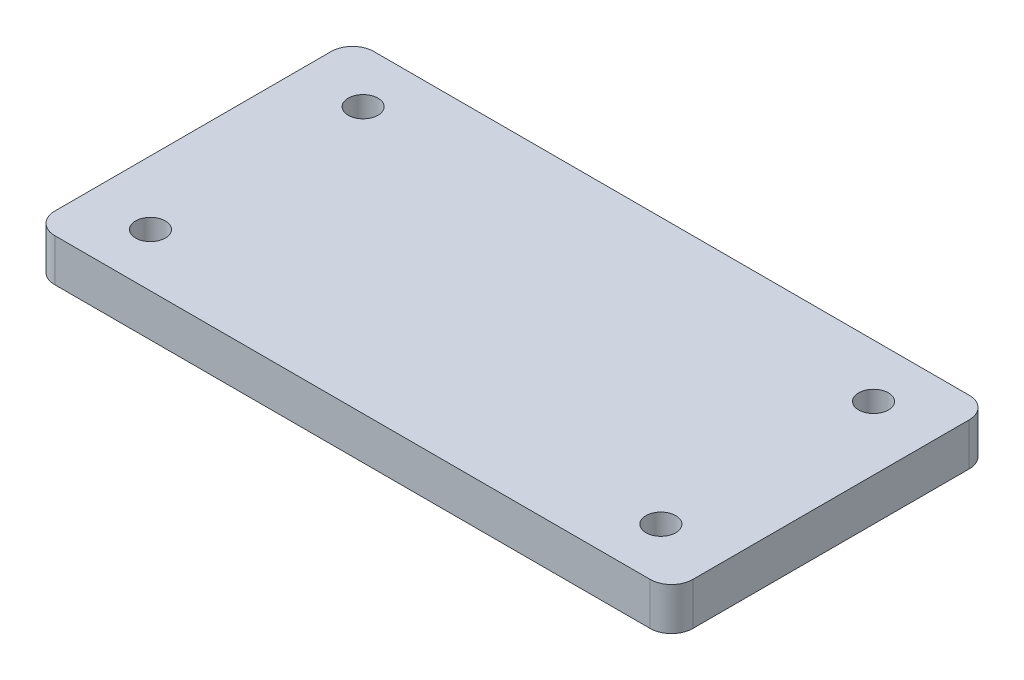
ISO-10303-21;
HEADER;
FILE_DESCRIPTION(('STEP AP214'),'2;1');
FILE_NAME('part.step','',(''),(''),'','','');
FILE_SCHEMA(('AUTOMOTIVE_DESIGN { 1 0 10303 214 1 1 1 1 }'));
ENDSEC;
DATA;
#1=APPLICATION_CONTEXT('core data for automotive mechanical design processes');
#2=APPLICATION_PROTOCOL_DEFINITION('international standard','automotive_design',2000,#1);
#3=PRODUCT_CONTEXT('',#1,'mechanical');
#4=PRODUCT('Part','Part','',(#3));
#5=PRODUCT_RELATED_PRODUCT_CATEGORY('part','',(#4));
#6=PRODUCT_DEFINITION_FORMATION('','',#4);
#7=PRODUCT_DEFINITION_CONTEXT('part definition',#1,'design');
#8=PRODUCT_DEFINITION('design','',#6,#7);
#9=PRODUCT_DEFINITION_SHAPE('','',#8);
#10=(LENGTH_UNIT() NAMED_UNIT(*) SI_UNIT(.MILLI.,.METRE.));
#11=(NAMED_UNIT(*) PLANE_ANGLE_UNIT() SI_UNIT($,.RADIAN.));
#12=(NAMED_UNIT(*) SI_UNIT($,.STERADIAN.) SOLID_ANGLE_UNIT());
#13=UNCERTAINTY_MEASURE_WITH_UNIT(LENGTH_MEASURE(1.E-05),#10,'distance_accuracy_value','');
#14=(GEOMETRIC_REPRESENTATION_CONTEXT(3) GLOBAL_UNCERTAINTY_ASSIGNED_CONTEXT((#13)) GLOBAL_UNIT_ASSIGNED_CONTEXT((#10,
#11,#12)) REPRESENTATION_CONTEXT('',''));
#15=CARTESIAN_POINT('',(0.,0.,0.));
#16=DIRECTION('',(0.,0.,1.));
#17=DIRECTION('',(1.,0.,0.));
#18=AXIS2_PLACEMENT_3D('',#15,#16,#17);
#19=CARTESIAN_POINT('',(150.,20.,75.));
#20=DIRECTION('',(-1.,0.,0.));
#21=DIRECTION('',(0.,0.,1.));
#22=AXIS2_PLACEMENT_3D('',#19,#20,#21);
#23=PLANE('',#22);
#24=DIRECTION('',(0.,0.,-1.));
#25=VECTOR('',#24,1.);
#26=CARTESIAN_POINT('',(150.,0.,75.));
#27=LINE('',#26,#25);
#28=CARTESIAN_POINT('',(150.,0.,65.));
#29=VERTEX_POINT('',#28);
#30=CARTESIAN_POINT('',(150.,0.,-65.));
#31=VERTEX_POINT('',#30);
#32=EDGE_CURVE('E160',#29,#31,#27,.T.);
#33=ORIENTED_EDGE('',*,*,#32,.T.);
#34=DIRECTION('',(0.,-1.,0.));
#35=VECTOR('',#34,1.);
#36=CARTESIAN_POINT('',(150.,20.,-65.));
#37=LINE('',#36,#35);
#38=CARTESIAN_POINT('',(150.,20.,-65.));
#39=VERTEX_POINT('',#38);
#40=EDGE_CURVE('E11',#31,#39,#37,.F.);
#41=ORIENTED_EDGE('',*,*,#40,.T.);
#42=DIRECTION('',(0.,0.,-1.));
#43=VECTOR('',#42,1.);
#44=CARTESIAN_POINT('',(150.,20.,75.));
#45=LINE('',#44,#43);
#46=CARTESIAN_POINT('',(150.,20.,65.));
#47=VERTEX_POINT('',#46);
#48=EDGE_CURVE('E128',#47,#39,#45,.T.);
#49=ORIENTED_EDGE('',*,*,#48,.F.);
#50=DIRECTION('',(0.,-1.,0.));
#51=VECTOR('',#50,1.);
#52=CARTESIAN_POINT('',(150.,20.,65.));
#53=LINE('',#52,#51);
#54=EDGE_CURVE('E44',#47,#29,#53,.T.);
#55=ORIENTED_EDGE('',*,*,#54,.T.);
#56=EDGE_LOOP('',(#33,#41,#49,#55));
#57=FACE_BOUND('',#56,.T.);
#58=ADVANCED_FACE('F36',(#57),#23,.F.);
#59=CARTESIAN_POINT('',(-150.,20.,-75.));
#60=DIRECTION('',(0.,0.,1.));
#61=DIRECTION('',(1.,0.,0.));
#62=AXIS2_PLACEMENT_3D('',#59,#60,#61);
#63=PLANE('',#62);
#64=DIRECTION('',(-1.,0.,0.));
#65=VECTOR('',#64,1.);
#66=CARTESIAN_POINT('',(-150.,0.,-75.));
#67=LINE('',#66,#65);
#68=CARTESIAN_POINT('',(140.,0.,-75.));
#69=VERTEX_POINT('',#68);
#70=CARTESIAN_POINT('',(-140.,0.,-75.));
#71=VERTEX_POINT('',#70);
#72=EDGE_CURVE('E133',#69,#71,#67,.T.);
#73=ORIENTED_EDGE('',*,*,#72,.T.);
#74=DIRECTION('',(0.,-1.,0.));
#75=VECTOR('',#74,1.);
#76=CARTESIAN_POINT('',(-140.,20.,-75.));
#77=LINE('',#76,#75);
#78=CARTESIAN_POINT('',(-140.,20.,-75.));
#79=VERTEX_POINT('',#78);
#80=EDGE_CURVE('E51',#71,#79,#77,.F.);
#81=ORIENTED_EDGE('',*,*,#80,.T.);
#82=DIRECTION('',(-1.,0.,0.));
#83=VECTOR('',#82,1.);
#84=CARTESIAN_POINT('',(-150.,20.,-75.));
#85=LINE('',#84,#83);
#86=CARTESIAN_POINT('',(140.,20.,-75.));
#87=VERTEX_POINT('',#86);
#88=EDGE_CURVE('E131',#87,#79,#85,.T.);
#89=ORIENTED_EDGE('',*,*,#88,.F.);
#90=DIRECTION('',(0.,-1.,0.));
#91=VECTOR('',#90,1.);
#92=CARTESIAN_POINT('',(140.,20.,-75.));
#93=LINE('',#92,#91);
#94=EDGE_CURVE('E152',#87,#69,#93,.T.);
#95=ORIENTED_EDGE('',*,*,#94,.T.);
#96=EDGE_LOOP('',(#73,#81,#89,#95));
#97=FACE_BOUND('',#96,.T.);
#98=ADVANCED_FACE('F215',(#97),#63,.F.);
#99=CARTESIAN_POINT('',(-150.,20.,75.));
#100=DIRECTION('',(1.,0.,0.));
#101=DIRECTION('',(0.,0.,-1.));
#102=AXIS2_PLACEMENT_3D('',#99,#100,#101);
#103=PLANE('',#102);
#104=DIRECTION('',(0.,0.,1.));
#105=VECTOR('',#104,1.);
#106=CARTESIAN_POINT('',(-150.,0.,75.));
#107=LINE('',#106,#105);
#108=CARTESIAN_POINT('',(-150.,0.,-65.));
#109=VERTEX_POINT('',#108);
#110=CARTESIAN_POINT('',(-150.,0.,65.));
#111=VERTEX_POINT('',#110);
#112=EDGE_CURVE('E129',#109,#111,#107,.T.);
#113=ORIENTED_EDGE('',*,*,#112,.T.);
#114=DIRECTION('',(0.,-1.,0.));
#115=VECTOR('',#114,1.);
#116=CARTESIAN_POINT('',(-150.,20.,65.));
#117=LINE('',#116,#115);
#118=CARTESIAN_POINT('',(-150.,20.,65.));
#119=VERTEX_POINT('',#118);
#120=EDGE_CURVE('E107',#111,#119,#117,.F.);
#121=ORIENTED_EDGE('',*,*,#120,.T.);
#122=DIRECTION('',(0.,0.,1.));
#123=VECTOR('',#122,1.);
#124=CARTESIAN_POINT('',(-150.,20.,75.));
#125=LINE('',#124,#123);
#126=CARTESIAN_POINT('',(-150.,20.,-65.));
#127=VERTEX_POINT('',#126);
#128=EDGE_CURVE('E172',#127,#119,#125,.T.);
#129=ORIENTED_EDGE('',*,*,#128,.F.);
#130=DIRECTION('',(0.,-1.,0.));
#131=VECTOR('',#130,1.);
#132=CARTESIAN_POINT('',(-150.,20.,-65.));
#133=LINE('',#132,#131);
#134=EDGE_CURVE('E112',#127,#109,#133,.T.);
#135=ORIENTED_EDGE('',*,*,#134,.T.);
#136=EDGE_LOOP('',(#113,#121,#129,#135));
#137=FACE_BOUND('',#136,.T.);
#138=ADVANCED_FACE('F212',(#137),#103,.F.);
#139=CARTESIAN_POINT('',(-150.,20.,75.));
#140=DIRECTION('',(0.,0.,-1.));
#141=DIRECTION('',(-1.,0.,0.));
#142=AXIS2_PLACEMENT_3D('',#139,#140,#141);
#143=PLANE('',#142);
#144=DIRECTION('',(1.,0.,0.));
#145=VECTOR('',#144,1.);
#146=CARTESIAN_POINT('',(-150.,20.,75.));
#147=LINE('',#146,#145);
#148=CARTESIAN_POINT('',(-140.,20.,75.));
#149=VERTEX_POINT('',#148);
#150=CARTESIAN_POINT('',(140.,20.,75.));
#151=VERTEX_POINT('',#150);
#152=EDGE_CURVE('E122',#149,#151,#147,.T.);
#153=ORIENTED_EDGE('',*,*,#152,.F.);
#154=DIRECTION('',(0.,-1.,0.));
#155=VECTOR('',#154,1.);
#156=CARTESIAN_POINT('',(-140.,20.,75.));
#157=LINE('',#156,#155);
#158=CARTESIAN_POINT('',(-140.,0.,75.));
#159=VERTEX_POINT('',#158);
#160=EDGE_CURVE('E106',#149,#159,#157,.T.);
#161=ORIENTED_EDGE('',*,*,#160,.T.);
#162=DIRECTION('',(1.,0.,0.));
#163=VECTOR('',#162,1.);
#164=CARTESIAN_POINT('',(-150.,0.,75.));
#165=LINE('',#164,#163);
#166=CARTESIAN_POINT('',(140.,0.,75.));
#167=VERTEX_POINT('',#166);
#168=EDGE_CURVE('E119',#159,#167,#165,.T.);
#169=ORIENTED_EDGE('',*,*,#168,.T.);
#170=DIRECTION('',(0.,-1.,0.));
#171=VECTOR('',#170,1.);
#172=CARTESIAN_POINT('',(140.,20.,75.));
#173=LINE('',#172,#171);
#174=EDGE_CURVE('E124',#167,#151,#173,.F.);
#175=ORIENTED_EDGE('',*,*,#174,.T.);
#176=EDGE_LOOP('',(#153,#161,#169,#175));
#177=FACE_BOUND('',#176,.T.);
#178=ADVANCED_FACE('F118',(#177),#143,.F.);
#179=CARTESIAN_POINT('',(0.,20.,0.));
#180=DIRECTION('',(0.,-1.,0.));
#181=DIRECTION('',(0.,0.,-1.));
#182=AXIS2_PLACEMENT_3D('',#179,#180,#181);
#183=PLANE('',#182);
#184=CARTESIAN_POINT('',(-120.,20.,-50.));
#185=DIRECTION('',(0.,1.,0.));
#186=DIRECTION('',(0.,0.,1.));
#187=AXIS2_PLACEMENT_3D('',#184,#185,#186);
#188=CIRCLE('',#187,6.99999999999999);
#189=CARTESIAN_POINT('',(-120.,20.,-43.));
#190=VERTEX_POINT('',#189);
#191=EDGE_CURVE('E193',#190,#190,#188,.T.);
#192=ORIENTED_EDGE('',*,*,#191,.F.);
#193=EDGE_LOOP('',(#192));
#194=FACE_BOUND('',#193,.T.);
#195=CARTESIAN_POINT('',(120.,20.,-50.));
#196=DIRECTION('',(0.,1.,0.));
#197=DIRECTION('',(0.,0.,1.));
#198=AXIS2_PLACEMENT_3D('',#195,#196,#197);
#199=CIRCLE('',#198,6.99999999999999);
#200=CARTESIAN_POINT('',(120.,20.,-43.));
#201=VERTEX_POINT('',#200);
#202=EDGE_CURVE('E187',#201,#201,#199,.T.);
#203=ORIENTED_EDGE('',*,*,#202,.F.);
#204=EDGE_LOOP('',(#203));
#205=FACE_BOUND('',#204,.T.);
#206=CARTESIAN_POINT('',(120.,20.,50.));
#207=DIRECTION('',(0.,1.,0.));
#208=DIRECTION('',(0.,0.,1.));
#209=AXIS2_PLACEMENT_3D('',#206,#207,#208);
#210=CIRCLE('',#209,6.99999999999999);
#211=CARTESIAN_POINT('',(120.,20.,57.));
#212=VERTEX_POINT('',#211);
#213=EDGE_CURVE('E181',#212,#212,#210,.T.);
#214=ORIENTED_EDGE('',*,*,#213,.F.);
#215=EDGE_LOOP('',(#214));
#216=FACE_BOUND('',#215,.T.);
#217=CARTESIAN_POINT('',(-120.,20.,50.));
#218=DIRECTION('',(0.,1.,0.));
#219=DIRECTION('',(0.,0.,1.));
#220=AXIS2_PLACEMENT_3D('',#217,#218,#219);
#221=CIRCLE('',#220,6.99999999999999);
#222=CARTESIAN_POINT('',(-120.,20.,57.));
#223=VERTEX_POINT('',#222);
#224=EDGE_CURVE('E168',#223,#223,#221,.T.);
#225=ORIENTED_EDGE('',*,*,#224,.F.);
#226=EDGE_LOOP('',(#225));
#227=FACE_BOUND('',#226,.T.);
#228=ORIENTED_EDGE('',*,*,#128,.T.);
#229=CARTESIAN_POINT('',(-140.,20.,65.));
#230=DIRECTION('',(0.,-1.,0.));
#231=DIRECTION('',(0.,0.,-1.));
#232=AXIS2_PLACEMENT_3D('',#229,#230,#231);
#233=CIRCLE('',#232,10.);
#234=EDGE_CURVE('E150',#119,#149,#233,.F.);
#235=ORIENTED_EDGE('',*,*,#234,.T.);
#236=ORIENTED_EDGE('',*,*,#152,.T.);
#237=CARTESIAN_POINT('',(140.,20.,65.));
#238=DIRECTION('',(0.,-1.,0.));
#239=DIRECTION('',(0.,0.,-1.));
#240=AXIS2_PLACEMENT_3D('',#237,#238,#239);
#241=CIRCLE('',#240,10.);
#242=EDGE_CURVE('E145',#151,#47,#241,.F.);
#243=ORIENTED_EDGE('',*,*,#242,.T.);
#244=ORIENTED_EDGE('',*,*,#48,.T.);
#245=CARTESIAN_POINT('',(140.,20.,-65.));
#246=DIRECTION('',(0.,-1.,0.));
#247=DIRECTION('',(0.,0.,-1.));
#248=AXIS2_PLACEMENT_3D('',#245,#246,#247);
#249=CIRCLE('',#248,10.);
#250=EDGE_CURVE('E58',#39,#87,#249,.F.);
#251=ORIENTED_EDGE('',*,*,#250,.T.);
#252=ORIENTED_EDGE('',*,*,#88,.T.);
#253=CARTESIAN_POINT('',(-140.,20.,-65.));
#254=DIRECTION('',(0.,-1.,0.));
#255=DIRECTION('',(0.,0.,-1.));
#256=AXIS2_PLACEMENT_3D('',#253,#254,#255);
#257=CIRCLE('',#256,10.);
#258=EDGE_CURVE('E148',#79,#127,#257,.F.);
#259=ORIENTED_EDGE('',*,*,#258,.T.);
#260=EDGE_LOOP('',(#228,#235,#236,#243,#244,#251,#252,#259));
#261=FACE_BOUND('',#260,.T.);
#262=ADVANCED_FACE('F199',(#194,#205,#216,#227,#261),#183,.F.);
#263=CARTESIAN_POINT('',(0.,0.,0.));
#264=DIRECTION('',(0.,-1.,0.));
#265=DIRECTION('',(0.,0.,-1.));
#266=AXIS2_PLACEMENT_3D('',#263,#264,#265);
#267=PLANE('',#266);
#268=CARTESIAN_POINT('',(-120.,0.,-50.));
#269=DIRECTION('',(0.,1.,0.));
#270=DIRECTION('',(0.,0.,1.));
#271=AXIS2_PLACEMENT_3D('',#268,#269,#270);
#272=CIRCLE('',#271,6.99999999999999);
#273=CARTESIAN_POINT('',(-120.,0.,-43.));
#274=VERTEX_POINT('',#273);
#275=EDGE_CURVE('E190',#274,#274,#272,.T.);
#276=ORIENTED_EDGE('',*,*,#275,.T.);
#277=EDGE_LOOP('',(#276));
#278=FACE_BOUND('',#277,.T.);
#279=CARTESIAN_POINT('',(120.,0.,-50.));
#280=DIRECTION('',(0.,1.,0.));
#281=DIRECTION('',(0.,0.,1.));
#282=AXIS2_PLACEMENT_3D('',#279,#280,#281);
#283=CIRCLE('',#282,6.99999999999999);
#284=CARTESIAN_POINT('',(120.,0.,-43.));
#285=VERTEX_POINT('',#284);
#286=EDGE_CURVE('E184',#285,#285,#283,.T.);
#287=ORIENTED_EDGE('',*,*,#286,.T.);
#288=EDGE_LOOP('',(#287));
#289=FACE_BOUND('',#288,.T.);
#290=CARTESIAN_POINT('',(120.,0.,50.));
#291=DIRECTION('',(0.,1.,0.));
#292=DIRECTION('',(0.,0.,1.));
#293=AXIS2_PLACEMENT_3D('',#290,#291,#292);
#294=CIRCLE('',#293,6.99999999999999);
#295=CARTESIAN_POINT('',(120.,0.,57.));
#296=VERTEX_POINT('',#295);
#297=EDGE_CURVE('E178',#296,#296,#294,.T.);
#298=ORIENTED_EDGE('',*,*,#297,.T.);
#299=EDGE_LOOP('',(#298));
#300=FACE_BOUND('',#299,.T.);
#301=CARTESIAN_POINT('',(-120.,0.,50.));
#302=DIRECTION('',(0.,1.,0.));
#303=DIRECTION('',(0.,0.,1.));
#304=AXIS2_PLACEMENT_3D('',#301,#302,#303);
#305=CIRCLE('',#304,6.99999999999999);
#306=CARTESIAN_POINT('',(-120.,0.,57.));
#307=VERTEX_POINT('',#306);
#308=EDGE_CURVE('E165',#307,#307,#305,.T.);
#309=ORIENTED_EDGE('',*,*,#308,.T.);
#310=EDGE_LOOP('',(#309));
#311=FACE_BOUND('',#310,.T.);
#312=ORIENTED_EDGE('',*,*,#168,.F.);
#313=CARTESIAN_POINT('',(-140.,0.,65.));
#314=DIRECTION('',(0.,-1.,0.));
#315=DIRECTION('',(0.,0.,-1.));
#316=AXIS2_PLACEMENT_3D('',#313,#314,#315);
#317=CIRCLE('',#316,10.);
#318=EDGE_CURVE('E102',#159,#111,#317,.T.);
#319=ORIENTED_EDGE('',*,*,#318,.T.);
#320=ORIENTED_EDGE('',*,*,#112,.F.);
#321=CARTESIAN_POINT('',(-140.,0.,-65.));
#322=DIRECTION('',(0.,-1.,0.));
#323=DIRECTION('',(0.,0.,-1.));
#324=AXIS2_PLACEMENT_3D('',#321,#322,#323);
#325=CIRCLE('',#324,10.);
#326=EDGE_CURVE('E113',#109,#71,#325,.T.);
#327=ORIENTED_EDGE('',*,*,#326,.T.);
#328=ORIENTED_EDGE('',*,*,#72,.F.);
#329=CARTESIAN_POINT('',(140.,0.,-65.));
#330=DIRECTION('',(0.,-1.,0.));
#331=DIRECTION('',(0.,0.,-1.));
#332=AXIS2_PLACEMENT_3D('',#329,#330,#331);
#333=CIRCLE('',#332,10.);
#334=EDGE_CURVE('E139',#69,#31,#333,.T.);
#335=ORIENTED_EDGE('',*,*,#334,.T.);
#336=ORIENTED_EDGE('',*,*,#32,.F.);
#337=CARTESIAN_POINT('',(140.,0.,65.));
#338=DIRECTION('',(0.,-1.,0.));
#339=DIRECTION('',(0.,0.,-1.));
#340=AXIS2_PLACEMENT_3D('',#337,#338,#339);
#341=CIRCLE('',#340,10.);
#342=EDGE_CURVE('E123',#29,#167,#341,.T.);
#343=ORIENTED_EDGE('',*,*,#342,.T.);
#344=EDGE_LOOP('',(#312,#319,#320,#327,#328,#335,#336,#343));
#345=FACE_BOUND('',#344,.T.);
#346=ADVANCED_FACE('F126',(#278,#289,#300,#311,#345),#267,.T.);
#347=CARTESIAN_POINT('',(-140.,20.,65.));
#348=DIRECTION('',(0.,-1.,0.));
#349=DIRECTION('',(0.,0.,-1.));
#350=AXIS2_PLACEMENT_3D('',#347,#348,#349);
#351=CYLINDRICAL_SURFACE('',#350,10.);
#352=ORIENTED_EDGE('',*,*,#234,.F.);
#353=ORIENTED_EDGE('',*,*,#120,.F.);
#354=ORIENTED_EDGE('',*,*,#318,.F.);
#355=ORIENTED_EDGE('',*,*,#160,.F.);
#356=EDGE_LOOP('',(#352,#353,#354,#355));
#357=FACE_BOUND('',#356,.T.);
#358=ADVANCED_FACE('F105',(#357),#351,.T.);
#359=CARTESIAN_POINT('',(-140.,20.,-65.));
#360=DIRECTION('',(0.,-1.,0.));
#361=DIRECTION('',(0.,0.,-1.));
#362=AXIS2_PLACEMENT_3D('',#359,#360,#361);
#363=CYLINDRICAL_SURFACE('',#362,10.);
#364=ORIENTED_EDGE('',*,*,#258,.F.);
#365=ORIENTED_EDGE('',*,*,#80,.F.);
#366=ORIENTED_EDGE('',*,*,#326,.F.);
#367=ORIENTED_EDGE('',*,*,#134,.F.);
#368=EDGE_LOOP('',(#364,#365,#366,#367));
#369=FACE_BOUND('',#368,.T.);
#370=ADVANCED_FACE('F214',(#369),#363,.T.);
#371=CARTESIAN_POINT('',(140.,20.,-65.));
#372=DIRECTION('',(0.,-1.,0.));
#373=DIRECTION('',(0.,0.,-1.));
#374=AXIS2_PLACEMENT_3D('',#371,#372,#373);
#375=CYLINDRICAL_SURFACE('',#374,10.);
#376=ORIENTED_EDGE('',*,*,#250,.F.);
#377=ORIENTED_EDGE('',*,*,#40,.F.);
#378=ORIENTED_EDGE('',*,*,#334,.F.);
#379=ORIENTED_EDGE('',*,*,#94,.F.);
#380=EDGE_LOOP('',(#376,#377,#378,#379));
#381=FACE_BOUND('',#380,.T.);
#382=ADVANCED_FACE('F218',(#381),#375,.T.);
#383=CARTESIAN_POINT('',(140.,20.,65.));
#384=DIRECTION('',(0.,-1.,0.));
#385=DIRECTION('',(0.,0.,-1.));
#386=AXIS2_PLACEMENT_3D('',#383,#384,#385);
#387=CYLINDRICAL_SURFACE('',#386,10.);
#388=ORIENTED_EDGE('',*,*,#242,.F.);
#389=ORIENTED_EDGE('',*,*,#174,.F.);
#390=ORIENTED_EDGE('',*,*,#342,.F.);
#391=ORIENTED_EDGE('',*,*,#54,.F.);
#392=EDGE_LOOP('',(#388,#389,#390,#391));
#393=FACE_BOUND('',#392,.T.);
#394=ADVANCED_FACE('F38',(#393),#387,.T.);
#395=CARTESIAN_POINT('',(-120.,20.,50.));
#396=DIRECTION('',(0.,1.,0.));
#397=DIRECTION('',(0.,0.,1.));
#398=AXIS2_PLACEMENT_3D('',#395,#396,#397);
#399=CYLINDRICAL_SURFACE('',#398,6.99999999999999);
#400=ORIENTED_EDGE('',*,*,#308,.F.);
#401=EDGE_LOOP('',(#400));
#402=FACE_BOUND('',#401,.T.);
#403=ORIENTED_EDGE('',*,*,#224,.T.);
#404=EDGE_LOOP('',(#403));
#405=FACE_BOUND('',#404,.T.);
#406=ADVANCED_FACE('F220',(#402,#405),#399,.F.);
#407=CARTESIAN_POINT('',(120.,20.,50.));
#408=DIRECTION('',(0.,1.,0.));
#409=DIRECTION('',(0.,0.,1.));
#410=AXIS2_PLACEMENT_3D('',#407,#408,#409);
#411=CYLINDRICAL_SURFACE('',#410,6.99999999999999);
#412=ORIENTED_EDGE('',*,*,#297,.F.);
#413=EDGE_LOOP('',(#412));
#414=FACE_BOUND('',#413,.T.);
#415=ORIENTED_EDGE('',*,*,#213,.T.);
#416=EDGE_LOOP('',(#415));
#417=FACE_BOUND('',#416,.T.);
#418=ADVANCED_FACE('F225',(#414,#417),#411,.F.);
#419=CARTESIAN_POINT('',(120.,20.,-50.));
#420=DIRECTION('',(0.,1.,0.));
#421=DIRECTION('',(0.,0.,1.));
#422=AXIS2_PLACEMENT_3D('',#419,#420,#421);
#423=CYLINDRICAL_SURFACE('',#422,6.99999999999999);
#424=ORIENTED_EDGE('',*,*,#286,.F.);
#425=EDGE_LOOP('',(#424));
#426=FACE_BOUND('',#425,.T.);
#427=ORIENTED_EDGE('',*,*,#202,.T.);
#428=EDGE_LOOP('',(#427));
#429=FACE_BOUND('',#428,.T.);
#430=ADVANCED_FACE('F286',(#426,#429),#423,.F.);
#431=CARTESIAN_POINT('',(-120.,20.,-50.));
#432=DIRECTION('',(0.,1.,0.));
#433=DIRECTION('',(0.,0.,1.));
#434=AXIS2_PLACEMENT_3D('',#431,#432,#433);
#435=CYLINDRICAL_SURFACE('',#434,6.99999999999999);
#436=ORIENTED_EDGE('',*,*,#275,.F.);
#437=EDGE_LOOP('',(#436));
#438=FACE_BOUND('',#437,.T.);
#439=ORIENTED_EDGE('',*,*,#191,.T.);
#440=EDGE_LOOP('',(#439));
#441=FACE_BOUND('',#440,.T.);
#442=ADVANCED_FACE('F197',(#438,#441),#435,.F.);
#443=CLOSED_SHELL('',(#58,#98,#138,#178,#262,#346,#358,#370,#382,#394,#406,#418,#430,#442));
#444=MANIFOLD_SOLID_BREP('B2',#443);
#445=ADVANCED_BREP_SHAPE_REPRESENTATION('',(#18,#444),#14);
#446=SHAPE_DEFINITION_REPRESENTATION(#9,#445);
ENDSEC;
END-ISO-10303-21;
